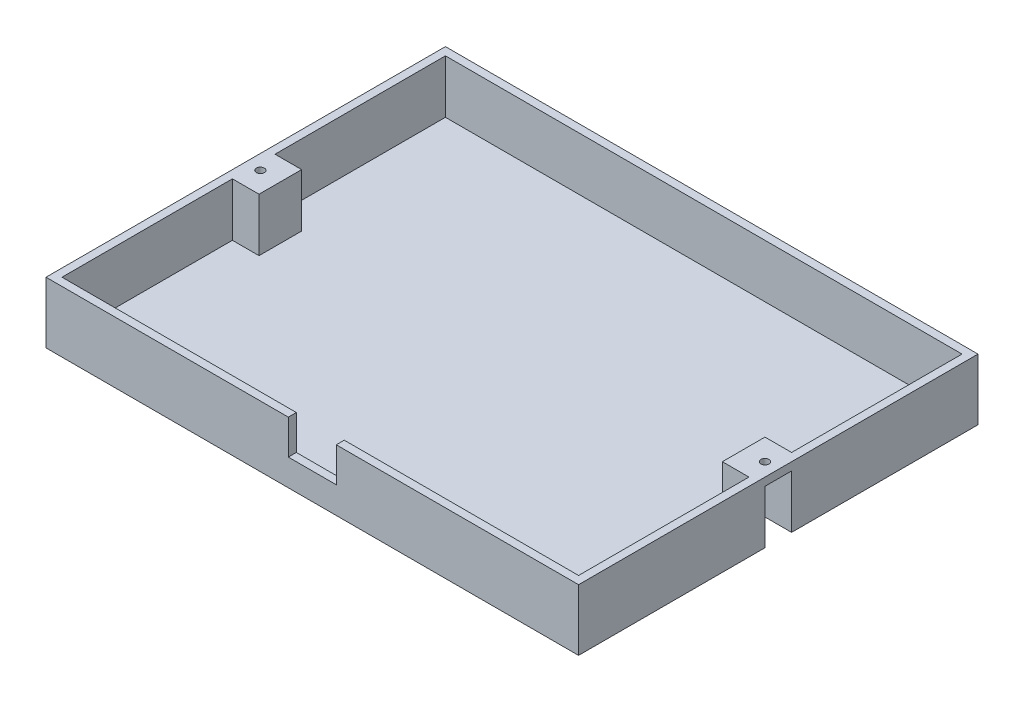
ISO-10303-21;
HEADER;
FILE_DESCRIPTION(('STEP AP214'),'2;1');
FILE_NAME('part.step','',(''),(''),'','','');
FILE_SCHEMA(('AUTOMOTIVE_DESIGN { 1 0 10303 214 1 1 1 1 }'));
ENDSEC;
DATA;
#1=APPLICATION_CONTEXT('core data for automotive mechanical design processes');
#2=APPLICATION_PROTOCOL_DEFINITION('international standard','automotive_design',2000,#1);
#3=PRODUCT_CONTEXT('',#1,'mechanical');
#4=PRODUCT('Part','Part','',(#3));
#5=PRODUCT_RELATED_PRODUCT_CATEGORY('part','',(#4));
#6=PRODUCT_DEFINITION_FORMATION('','',#4);
#7=PRODUCT_DEFINITION_CONTEXT('part definition',#1,'design');
#8=PRODUCT_DEFINITION('design','',#6,#7);
#9=PRODUCT_DEFINITION_SHAPE('','',#8);
#10=(LENGTH_UNIT() NAMED_UNIT(*) SI_UNIT(.MILLI.,.METRE.));
#11=(NAMED_UNIT(*) PLANE_ANGLE_UNIT() SI_UNIT($,.RADIAN.));
#12=(NAMED_UNIT(*) SI_UNIT($,.STERADIAN.) SOLID_ANGLE_UNIT());
#13=UNCERTAINTY_MEASURE_WITH_UNIT(LENGTH_MEASURE(1.E-05),#10,'distance_accuracy_value','');
#14=(GEOMETRIC_REPRESENTATION_CONTEXT(3) GLOBAL_UNCERTAINTY_ASSIGNED_CONTEXT((#13)) GLOBAL_UNIT_ASSIGNED_CONTEXT((#10,
#11,#12)) REPRESENTATION_CONTEXT('',''));
#15=CARTESIAN_POINT('',(0.,0.,0.));
#16=DIRECTION('',(0.,0.,1.));
#17=DIRECTION('',(1.,0.,0.));
#18=AXIS2_PLACEMENT_3D('',#15,#16,#17);
#19=CARTESIAN_POINT('',(100.,23.,5.));
#20=DIRECTION('',(0.,0.,1.));
#21=DIRECTION('',(1.,0.,0.));
#22=AXIS2_PLACEMENT_3D('',#19,#20,#21);
#23=PLANE('',#22);
#24=DIRECTION('',(1.,0.,0.));
#25=VECTOR('',#24,1.);
#26=CARTESIAN_POINT('',(90.,20.,5.));
#27=LINE('',#26,#25);
#28=CARTESIAN_POINT('',(90.,20.,5.));
#29=VERTEX_POINT('',#28);
#30=CARTESIAN_POINT('',(100.,20.,5.));
#31=VERTEX_POINT('',#30);
#32=EDGE_CURVE('E304',#29,#31,#27,.T.);
#33=ORIENTED_EDGE('',*,*,#32,.T.);
#34=DIRECTION('',(0.,-1.,0.));
#35=VECTOR('',#34,1.);
#36=CARTESIAN_POINT('',(100.,23.,5.));
#37=LINE('',#36,#35);
#38=CARTESIAN_POINT('',(100.,0.,5.));
#39=VERTEX_POINT('',#38);
#40=EDGE_CURVE('E499',#31,#39,#37,.T.);
#41=ORIENTED_EDGE('',*,*,#40,.T.);
#42=DIRECTION('',(1.,0.,0.));
#43=VECTOR('',#42,1.);
#44=CARTESIAN_POINT('',(90.,0.,5.));
#45=LINE('',#44,#43);
#46=CARTESIAN_POINT('',(90.,0.,5.));
#47=VERTEX_POINT('',#46);
#48=EDGE_CURVE('E296',#47,#39,#45,.T.);
#49=ORIENTED_EDGE('',*,*,#48,.F.);
#50=DIRECTION('',(0.,-1.,0.));
#51=VECTOR('',#50,1.);
#52=CARTESIAN_POINT('',(90.,23.,5.));
#53=LINE('',#52,#51);
#54=EDGE_CURVE('E496',#29,#47,#53,.T.);
#55=ORIENTED_EDGE('',*,*,#54,.F.);
#56=EDGE_LOOP('',(#33,#41,#49,#55));
#57=FACE_BOUND('',#56,.T.);
#58=ADVANCED_FACE('F39',(#57),#23,.F.);
#59=CARTESIAN_POINT('',(90.,23.,-5.));
#60=DIRECTION('',(-1.,0.,0.));
#61=DIRECTION('',(0.,0.,1.));
#62=AXIS2_PLACEMENT_3D('',#59,#60,#61);
#63=PLANE('',#62);
#64=DIRECTION('',(0.,0.,1.));
#65=VECTOR('',#64,1.);
#66=CARTESIAN_POINT('',(90.,20.,-5.));
#67=LINE('',#66,#65);
#68=CARTESIAN_POINT('',(90.,20.,-5.));
#69=VERTEX_POINT('',#68);
#70=EDGE_CURVE('E300',#69,#29,#67,.T.);
#71=ORIENTED_EDGE('',*,*,#70,.T.);
#72=ORIENTED_EDGE('',*,*,#54,.T.);
#73=DIRECTION('',(0.,0.,1.));
#74=VECTOR('',#73,1.);
#75=CARTESIAN_POINT('',(90.,0.,-5.));
#76=LINE('',#75,#74);
#77=CARTESIAN_POINT('',(90.,0.,-5.));
#78=VERTEX_POINT('',#77);
#79=EDGE_CURVE('E292',#78,#47,#76,.T.);
#80=ORIENTED_EDGE('',*,*,#79,.F.);
#81=DIRECTION('',(0.,-1.,0.));
#82=VECTOR('',#81,1.);
#83=CARTESIAN_POINT('',(90.,23.,-5.));
#84=LINE('',#83,#82);
#85=EDGE_CURVE('E63',#69,#78,#84,.T.);
#86=ORIENTED_EDGE('',*,*,#85,.F.);
#87=EDGE_LOOP('',(#71,#72,#80,#86));
#88=FACE_BOUND('',#87,.T.);
#89=ADVANCED_FACE('F605',(#88),#63,.F.);
#90=CARTESIAN_POINT('',(100.,23.,-5.));
#91=DIRECTION('',(0.,0.,-1.));
#92=DIRECTION('',(-1.,0.,0.));
#93=AXIS2_PLACEMENT_3D('',#90,#91,#92);
#94=PLANE('',#93);
#95=DIRECTION('',(-1.,0.,0.));
#96=VECTOR('',#95,1.);
#97=CARTESIAN_POINT('',(90.,20.,-5.));
#98=LINE('',#97,#96);
#99=CARTESIAN_POINT('',(100.,20.,-5.));
#100=VERTEX_POINT('',#99);
#101=EDGE_CURVE('E311',#100,#69,#98,.T.);
#102=ORIENTED_EDGE('',*,*,#101,.T.);
#103=ORIENTED_EDGE('',*,*,#85,.T.);
#104=DIRECTION('',(-1.,0.,0.));
#105=VECTOR('',#104,1.);
#106=CARTESIAN_POINT('',(100.,0.,-5.));
#107=LINE('',#106,#105);
#108=CARTESIAN_POINT('',(100.,0.,-5.));
#109=VERTEX_POINT('',#108);
#110=EDGE_CURVE('E285',#109,#78,#107,.T.);
#111=ORIENTED_EDGE('',*,*,#110,.F.);
#112=DIRECTION('',(0.,-1.,0.));
#113=VECTOR('',#112,1.);
#114=CARTESIAN_POINT('',(100.,23.,-5.));
#115=LINE('',#114,#113);
#116=EDGE_CURVE('E491',#100,#109,#115,.T.);
#117=ORIENTED_EDGE('',*,*,#116,.F.);
#118=EDGE_LOOP('',(#102,#103,#111,#117));
#119=FACE_BOUND('',#118,.T.);
#120=ADVANCED_FACE('F611',(#119),#94,.F.);
#121=CARTESIAN_POINT('',(-100.,23.,-5.));
#122=DIRECTION('',(0.,0.,-1.));
#123=DIRECTION('',(-1.,0.,0.));
#124=AXIS2_PLACEMENT_3D('',#121,#122,#123);
#125=PLANE('',#124);
#126=DIRECTION('',(-1.,0.,0.));
#127=VECTOR('',#126,1.);
#128=CARTESIAN_POINT('',(-100.,20.,-5.));
#129=LINE('',#128,#127);
#130=CARTESIAN_POINT('',(-90.,20.,-5.));
#131=VERTEX_POINT('',#130);
#132=CARTESIAN_POINT('',(-100.,20.,-5.));
#133=VERTEX_POINT('',#132);
#134=EDGE_CURVE('E338',#131,#133,#129,.T.);
#135=ORIENTED_EDGE('',*,*,#134,.T.);
#136=DIRECTION('',(0.,-1.,0.));
#137=VECTOR('',#136,1.);
#138=CARTESIAN_POINT('',(-100.,23.,-5.));
#139=LINE('',#138,#137);
#140=CARTESIAN_POINT('',(-100.,0.,-5.));
#141=VERTEX_POINT('',#140);
#142=EDGE_CURVE('E488',#133,#141,#139,.T.);
#143=ORIENTED_EDGE('',*,*,#142,.T.);
#144=DIRECTION('',(-1.,0.,0.));
#145=VECTOR('',#144,1.);
#146=CARTESIAN_POINT('',(-90.,0.,-5.));
#147=LINE('',#146,#145);
#148=CARTESIAN_POINT('',(-90.,0.,-5.));
#149=VERTEX_POINT('',#148);
#150=EDGE_CURVE('E322',#149,#141,#147,.T.);
#151=ORIENTED_EDGE('',*,*,#150,.F.);
#152=DIRECTION('',(0.,-1.,0.));
#153=VECTOR('',#152,1.);
#154=CARTESIAN_POINT('',(-90.,23.,-5.));
#155=LINE('',#154,#153);
#156=EDGE_CURVE('E485',#131,#149,#155,.T.);
#157=ORIENTED_EDGE('',*,*,#156,.F.);
#158=EDGE_LOOP('',(#135,#143,#151,#157));
#159=FACE_BOUND('',#158,.T.);
#160=ADVANCED_FACE('F543',(#159),#125,.F.);
#161=CARTESIAN_POINT('',(-90.,23.,-5.));
#162=DIRECTION('',(1.,0.,0.));
#163=DIRECTION('',(0.,0.,-1.));
#164=AXIS2_PLACEMENT_3D('',#161,#162,#163);
#165=PLANE('',#164);
#166=DIRECTION('',(0.,0.,-1.));
#167=VECTOR('',#166,1.);
#168=CARTESIAN_POINT('',(-90.,20.,-5.));
#169=LINE('',#168,#167);
#170=CARTESIAN_POINT('',(-90.,20.,5.));
#171=VERTEX_POINT('',#170);
#172=EDGE_CURVE('E334',#171,#131,#169,.T.);
#173=ORIENTED_EDGE('',*,*,#172,.T.);
#174=ORIENTED_EDGE('',*,*,#156,.T.);
#175=DIRECTION('',(0.,0.,-1.));
#176=VECTOR('',#175,1.);
#177=CARTESIAN_POINT('',(-90.,0.,5.));
#178=LINE('',#177,#176);
#179=CARTESIAN_POINT('',(-90.,0.,5.));
#180=VERTEX_POINT('',#179);
#181=EDGE_CURVE('E318',#180,#149,#178,.T.);
#182=ORIENTED_EDGE('',*,*,#181,.F.);
#183=DIRECTION('',(0.,-1.,0.));
#184=VECTOR('',#183,1.);
#185=CARTESIAN_POINT('',(-90.,23.,5.));
#186=LINE('',#185,#184);
#187=EDGE_CURVE('E482',#171,#180,#186,.T.);
#188=ORIENTED_EDGE('',*,*,#187,.F.);
#189=EDGE_LOOP('',(#173,#174,#182,#188));
#190=FACE_BOUND('',#189,.T.);
#191=ADVANCED_FACE('F837',(#190),#165,.F.);
#192=CARTESIAN_POINT('',(-100.,23.,5.));
#193=DIRECTION('',(0.,0.,1.));
#194=DIRECTION('',(1.,0.,0.));
#195=AXIS2_PLACEMENT_3D('',#192,#193,#194);
#196=PLANE('',#195);
#197=DIRECTION('',(1.,0.,0.));
#198=VECTOR('',#197,1.);
#199=CARTESIAN_POINT('',(-100.,20.,5.));
#200=LINE('',#199,#198);
#201=CARTESIAN_POINT('',(-100.,20.,5.));
#202=VERTEX_POINT('',#201);
#203=EDGE_CURVE('E330',#202,#171,#200,.T.);
#204=ORIENTED_EDGE('',*,*,#203,.T.);
#205=ORIENTED_EDGE('',*,*,#187,.T.);
#206=DIRECTION('',(1.,0.,0.));
#207=VECTOR('',#206,1.);
#208=CARTESIAN_POINT('',(-100.,0.,5.));
#209=LINE('',#208,#207);
#210=CARTESIAN_POINT('',(-100.,0.,5.));
#211=VERTEX_POINT('',#210);
#212=EDGE_CURVE('E314',#211,#180,#209,.T.);
#213=ORIENTED_EDGE('',*,*,#212,.F.);
#214=DIRECTION('',(0.,-1.,0.));
#215=VECTOR('',#214,1.);
#216=CARTESIAN_POINT('',(-100.,23.,5.));
#217=LINE('',#216,#215);
#218=EDGE_CURVE('E479',#202,#211,#217,.T.);
#219=ORIENTED_EDGE('',*,*,#218,.F.);
#220=EDGE_LOOP('',(#204,#205,#213,#219));
#221=FACE_BOUND('',#220,.T.);
#222=ADVANCED_FACE('F548',(#221),#196,.F.);
#223=CARTESIAN_POINT('',(100.,3.,-75.));
#224=DIRECTION('',(-1.,0.,0.));
#225=DIRECTION('',(0.,0.,1.));
#226=AXIS2_PLACEMENT_3D('',#223,#224,#225);
#227=PLANE('',#226);
#228=DIRECTION('',(0.,0.,-1.));
#229=VECTOR('',#228,1.);
#230=CARTESIAN_POINT('',(100.,0.,-75.));
#231=LINE('',#230,#229);
#232=CARTESIAN_POINT('',(100.,0.,75.));
#233=VERTEX_POINT('',#232);
#234=EDGE_CURVE('E503',#233,#39,#231,.T.);
#235=ORIENTED_EDGE('',*,*,#234,.T.);
#236=ORIENTED_EDGE('',*,*,#40,.F.);
#237=DIRECTION('',(0.,0.,-1.));
#238=VECTOR('',#237,1.);
#239=CARTESIAN_POINT('',(100.,20.,-5.));
#240=LINE('',#239,#238);
#241=EDGE_CURVE('E308',#31,#100,#240,.T.);
#242=ORIENTED_EDGE('',*,*,#241,.T.);
#243=ORIENTED_EDGE('',*,*,#116,.T.);
#244=CARTESIAN_POINT('',(100.,0.,-75.));
#245=VERTEX_POINT('',#244);
#246=EDGE_CURVE('E502',#109,#245,#231,.T.);
#247=ORIENTED_EDGE('',*,*,#246,.T.);
#248=DIRECTION('',(0.,-1.,0.));
#249=VECTOR('',#248,1.);
#250=CARTESIAN_POINT('',(100.,3.,-75.));
#251=LINE('',#250,#249);
#252=CARTESIAN_POINT('',(100.,23.,-75.));
#253=VERTEX_POINT('',#252);
#254=EDGE_CURVE('E11',#253,#245,#251,.T.);
#255=ORIENTED_EDGE('',*,*,#254,.F.);
#256=DIRECTION('',(0.,0.,-1.));
#257=VECTOR('',#256,1.);
#258=CARTESIAN_POINT('',(100.,23.,75.));
#259=LINE('',#258,#257);
#260=CARTESIAN_POINT('',(100.,23.,75.));
#261=VERTEX_POINT('',#260);
#262=EDGE_CURVE('E469',#261,#253,#259,.T.);
#263=ORIENTED_EDGE('',*,*,#262,.F.);
#264=DIRECTION('',(0.,-1.,0.));
#265=VECTOR('',#264,1.);
#266=CARTESIAN_POINT('',(100.,3.,75.));
#267=LINE('',#266,#265);
#268=EDGE_CURVE('E518',#261,#233,#267,.T.);
#269=ORIENTED_EDGE('',*,*,#268,.T.);
#270=EDGE_LOOP('',(#235,#236,#242,#243,#247,#255,#263,#269));
#271=FACE_BOUND('',#270,.T.);
#272=ADVANCED_FACE('F41',(#271),#227,.F.);
#273=CARTESIAN_POINT('',(-100.,3.,-75.));
#274=DIRECTION('',(0.,0.,1.));
#275=DIRECTION('',(1.,0.,0.));
#276=AXIS2_PLACEMENT_3D('',#273,#274,#275);
#277=PLANE('',#276);
#278=DIRECTION('',(-1.,0.,0.));
#279=VECTOR('',#278,1.);
#280=CARTESIAN_POINT('',(-100.,0.,-75.));
#281=LINE('',#280,#279);
#282=CARTESIAN_POINT('',(-100.,0.,-75.));
#283=VERTEX_POINT('',#282);
#284=EDGE_CURVE('E507',#245,#283,#281,.T.);
#285=ORIENTED_EDGE('',*,*,#284,.T.);
#286=DIRECTION('',(0.,-1.,0.));
#287=VECTOR('',#286,1.);
#288=CARTESIAN_POINT('',(-100.,3.,-75.));
#289=LINE('',#288,#287);
#290=CARTESIAN_POINT('',(-100.,23.,-75.));
#291=VERTEX_POINT('',#290);
#292=EDGE_CURVE('E48',#291,#283,#289,.T.);
#293=ORIENTED_EDGE('',*,*,#292,.F.);
#294=DIRECTION('',(-1.,0.,0.));
#295=VECTOR('',#294,1.);
#296=CARTESIAN_POINT('',(100.,23.,-75.));
#297=LINE('',#296,#295);
#298=EDGE_CURVE('E472',#253,#291,#297,.T.);
#299=ORIENTED_EDGE('',*,*,#298,.F.);
#300=ORIENTED_EDGE('',*,*,#254,.T.);
#301=EDGE_LOOP('',(#285,#293,#299,#300));
#302=FACE_BOUND('',#301,.T.);
#303=ADVANCED_FACE('F597',(#302),#277,.F.);
#304=CARTESIAN_POINT('',(-100.,3.,-75.));
#305=DIRECTION('',(1.,0.,0.));
#306=DIRECTION('',(0.,0.,-1.));
#307=AXIS2_PLACEMENT_3D('',#304,#305,#306);
#308=PLANE('',#307);
#309=DIRECTION('',(0.,0.,1.));
#310=VECTOR('',#309,1.);
#311=CARTESIAN_POINT('',(-100.,0.,-75.));
#312=LINE('',#311,#310);
#313=EDGE_CURVE('E511',#283,#141,#312,.T.);
#314=ORIENTED_EDGE('',*,*,#313,.T.);
#315=ORIENTED_EDGE('',*,*,#142,.F.);
#316=DIRECTION('',(0.,0.,1.));
#317=VECTOR('',#316,1.);
#318=CARTESIAN_POINT('',(-100.,20.,-5.));
#319=LINE('',#318,#317);
#320=EDGE_CURVE('E326',#133,#202,#319,.T.);
#321=ORIENTED_EDGE('',*,*,#320,.T.);
#322=ORIENTED_EDGE('',*,*,#218,.T.);
#323=CARTESIAN_POINT('',(-100.,0.,75.));
#324=VERTEX_POINT('',#323);
#325=EDGE_CURVE('E510',#211,#324,#312,.T.);
#326=ORIENTED_EDGE('',*,*,#325,.T.);
#327=DIRECTION('',(0.,-1.,0.));
#328=VECTOR('',#327,1.);
#329=CARTESIAN_POINT('',(-100.,3.,75.));
#330=LINE('',#329,#328);
#331=CARTESIAN_POINT('',(-100.,23.,75.));
#332=VERTEX_POINT('',#331);
#333=EDGE_CURVE('E522',#332,#324,#330,.T.);
#334=ORIENTED_EDGE('',*,*,#333,.F.);
#335=DIRECTION('',(0.,0.,1.));
#336=VECTOR('',#335,1.);
#337=CARTESIAN_POINT('',(-100.,23.,-75.));
#338=LINE('',#337,#336);
#339=EDGE_CURVE('E476',#291,#332,#338,.T.);
#340=ORIENTED_EDGE('',*,*,#339,.F.);
#341=ORIENTED_EDGE('',*,*,#292,.T.);
#342=EDGE_LOOP('',(#314,#315,#321,#322,#326,#334,#340,#341));
#343=FACE_BOUND('',#342,.T.);
#344=ADVANCED_FACE('F530',(#343),#308,.F.);
#345=CARTESIAN_POINT('',(-100.,3.,75.));
#346=DIRECTION('',(0.,0.,-1.));
#347=DIRECTION('',(-1.,0.,0.));
#348=AXIS2_PLACEMENT_3D('',#345,#346,#347);
#349=PLANE('',#348);
#350=DIRECTION('',(1.,0.,0.));
#351=VECTOR('',#350,1.);
#352=CARTESIAN_POINT('',(-9.,10.,75.));
#353=LINE('',#352,#351);
#354=CARTESIAN_POINT('',(-9.,10.,75.));
#355=VERTEX_POINT('',#354);
#356=CARTESIAN_POINT('',(9.,10.,75.));
#357=VERTEX_POINT('',#356);
#358=EDGE_CURVE('E254',#355,#357,#353,.T.);
#359=ORIENTED_EDGE('',*,*,#358,.F.);
#360=DIRECTION('',(0.,-1.,0.));
#361=VECTOR('',#360,1.);
#362=CARTESIAN_POINT('',(-9.,23.,75.));
#363=LINE('',#362,#361);
#364=CARTESIAN_POINT('',(-9.,23.,75.));
#365=VERTEX_POINT('',#364);
#366=EDGE_CURVE('E233',#365,#355,#363,.T.);
#367=ORIENTED_EDGE('',*,*,#366,.F.);
#368=DIRECTION('',(1.,0.,0.));
#369=VECTOR('',#368,1.);
#370=CARTESIAN_POINT('',(-100.,23.,75.));
#371=LINE('',#370,#369);
#372=EDGE_CURVE('E465',#332,#365,#371,.T.);
#373=ORIENTED_EDGE('',*,*,#372,.F.);
#374=ORIENTED_EDGE('',*,*,#333,.T.);
#375=DIRECTION('',(1.,0.,0.));
#376=VECTOR('',#375,1.);
#377=CARTESIAN_POINT('',(-100.,0.,75.));
#378=LINE('',#377,#376);
#379=EDGE_CURVE('E515',#324,#233,#378,.T.);
#380=ORIENTED_EDGE('',*,*,#379,.T.);
#381=ORIENTED_EDGE('',*,*,#268,.F.);
#382=CARTESIAN_POINT('',(9.,23.,75.));
#383=VERTEX_POINT('',#382);
#384=EDGE_CURVE('E464',#383,#261,#371,.T.);
#385=ORIENTED_EDGE('',*,*,#384,.F.);
#386=DIRECTION('',(0.,1.,0.));
#387=VECTOR('',#386,1.);
#388=CARTESIAN_POINT('',(9.,23.,75.));
#389=LINE('',#388,#387);
#390=EDGE_CURVE('E251',#357,#383,#389,.T.);
#391=ORIENTED_EDGE('',*,*,#390,.F.);
#392=EDGE_LOOP('',(#359,#367,#373,#374,#380,#381,#385,#391));
#393=FACE_BOUND('',#392,.T.);
#394=ADVANCED_FACE('F589',(#393),#349,.F.);
#395=CARTESIAN_POINT('',(0.,0.,0.));
#396=DIRECTION('',(0.,1.,0.));
#397=DIRECTION('',(0.,0.,1.));
#398=AXIS2_PLACEMENT_3D('',#395,#396,#397);
#399=PLANE('',#398);
#400=ORIENTED_EDGE('',*,*,#79,.T.);
#401=ORIENTED_EDGE('',*,*,#48,.T.);
#402=ORIENTED_EDGE('',*,*,#234,.F.);
#403=ORIENTED_EDGE('',*,*,#379,.F.);
#404=ORIENTED_EDGE('',*,*,#325,.F.);
#405=ORIENTED_EDGE('',*,*,#212,.T.);
#406=ORIENTED_EDGE('',*,*,#181,.T.);
#407=ORIENTED_EDGE('',*,*,#150,.T.);
#408=ORIENTED_EDGE('',*,*,#313,.F.);
#409=ORIENTED_EDGE('',*,*,#284,.F.);
#410=ORIENTED_EDGE('',*,*,#246,.F.);
#411=ORIENTED_EDGE('',*,*,#110,.T.);
#412=EDGE_LOOP('',(#400,#401,#402,#403,#404,#405,#406,#407,#408,#409,#410,#411));
#413=FACE_BOUND('',#412,.T.);
#414=ADVANCED_FACE('F537',(#413),#399,.F.);
#415=CARTESIAN_POINT('',(0.,23.,0.));
#416=DIRECTION('',(0.,1.,0.));
#417=DIRECTION('',(0.,0.,1.));
#418=AXIS2_PLACEMENT_3D('',#415,#416,#417);
#419=PLANE('',#418);
#420=DIRECTION('',(0.,0.,1.));
#421=VECTOR('',#420,1.);
#422=CARTESIAN_POINT('',(-9.,23.,72.));
#423=LINE('',#422,#421);
#424=CARTESIAN_POINT('',(-9.,23.,72.));
#425=VERTEX_POINT('',#424);
#426=EDGE_CURVE('E263',#425,#365,#423,.T.);
#427=ORIENTED_EDGE('',*,*,#426,.F.);
#428=DIRECTION('',(1.,0.,0.));
#429=VECTOR('',#428,1.);
#430=CARTESIAN_POINT('',(-97.,23.,72.));
#431=LINE('',#430,#429);
#432=CARTESIAN_POINT('',(-97.,23.,72.));
#433=VERTEX_POINT('',#432);
#434=EDGE_CURVE('E249',#433,#425,#431,.T.);
#435=ORIENTED_EDGE('',*,*,#434,.F.);
#436=DIRECTION('',(0.,0.,1.));
#437=VECTOR('',#436,1.);
#438=CARTESIAN_POINT('',(-97.,23.,8.));
#439=LINE('',#438,#437);
#440=CARTESIAN_POINT('',(-97.,23.,8.));
#441=VERTEX_POINT('',#440);
#442=EDGE_CURVE('E374',#441,#433,#439,.T.);
#443=ORIENTED_EDGE('',*,*,#442,.F.);
#444=DIRECTION('',(-1.,0.,0.));
#445=VECTOR('',#444,1.);
#446=CARTESIAN_POINT('',(-97.,23.,8.));
#447=LINE('',#446,#445);
#448=CARTESIAN_POINT('',(-87.,23.,8.));
#449=VERTEX_POINT('',#448);
#450=EDGE_CURVE('E371',#449,#441,#447,.T.);
#451=ORIENTED_EDGE('',*,*,#450,.F.);
#452=DIRECTION('',(0.,0.,1.));
#453=VECTOR('',#452,1.);
#454=CARTESIAN_POINT('',(-87.,23.,-8.));
#455=LINE('',#454,#453);
#456=CARTESIAN_POINT('',(-87.,23.,-8.));
#457=VERTEX_POINT('',#456);
#458=EDGE_CURVE('E368',#457,#449,#455,.T.);
#459=ORIENTED_EDGE('',*,*,#458,.F.);
#460=DIRECTION('',(1.,0.,0.));
#461=VECTOR('',#460,1.);
#462=CARTESIAN_POINT('',(-97.,23.,-8.));
#463=LINE('',#462,#461);
#464=CARTESIAN_POINT('',(-97.,23.,-8.));
#465=VERTEX_POINT('',#464);
#466=EDGE_CURVE('E365',#465,#457,#463,.T.);
#467=ORIENTED_EDGE('',*,*,#466,.F.);
#468=DIRECTION('',(0.,0.,1.));
#469=VECTOR('',#468,1.);
#470=CARTESIAN_POINT('',(-97.,23.,-72.));
#471=LINE('',#470,#469);
#472=CARTESIAN_POINT('',(-97.,23.,-72.));
#473=VERTEX_POINT('',#472);
#474=EDGE_CURVE('E362',#473,#465,#471,.T.);
#475=ORIENTED_EDGE('',*,*,#474,.F.);
#476=DIRECTION('',(-1.,0.,0.));
#477=VECTOR('',#476,1.);
#478=CARTESIAN_POINT('',(97.,23.,-72.));
#479=LINE('',#478,#477);
#480=CARTESIAN_POINT('',(97.,23.,-72.));
#481=VERTEX_POINT('',#480);
#482=EDGE_CURVE('E359',#481,#473,#479,.T.);
#483=ORIENTED_EDGE('',*,*,#482,.F.);
#484=DIRECTION('',(0.,0.,-1.));
#485=VECTOR('',#484,1.);
#486=CARTESIAN_POINT('',(97.,23.,-8.));
#487=LINE('',#486,#485);
#488=CARTESIAN_POINT('',(97.,23.,-8.));
#489=VERTEX_POINT('',#488);
#490=EDGE_CURVE('E356',#489,#481,#487,.T.);
#491=ORIENTED_EDGE('',*,*,#490,.F.);
#492=DIRECTION('',(1.,0.,0.));
#493=VECTOR('',#492,1.);
#494=CARTESIAN_POINT('',(97.,23.,-8.));
#495=LINE('',#494,#493);
#496=CARTESIAN_POINT('',(87.,23.,-8.));
#497=VERTEX_POINT('',#496);
#498=EDGE_CURVE('E353',#497,#489,#495,.T.);
#499=ORIENTED_EDGE('',*,*,#498,.F.);
#500=DIRECTION('',(0.,0.,-1.));
#501=VECTOR('',#500,1.);
#502=CARTESIAN_POINT('',(87.,23.,-8.));
#503=LINE('',#502,#501);
#504=CARTESIAN_POINT('',(87.,23.,8.));
#505=VERTEX_POINT('',#504);
#506=EDGE_CURVE('E350',#505,#497,#503,.T.);
#507=ORIENTED_EDGE('',*,*,#506,.F.);
#508=DIRECTION('',(-1.,0.,0.));
#509=VECTOR('',#508,1.);
#510=CARTESIAN_POINT('',(97.,23.,8.));
#511=LINE('',#510,#509);
#512=CARTESIAN_POINT('',(97.,23.,8.));
#513=VERTEX_POINT('',#512);
#514=EDGE_CURVE('E346',#513,#505,#511,.T.);
#515=ORIENTED_EDGE('',*,*,#514,.F.);
#516=DIRECTION('',(0.,0.,-1.));
#517=VECTOR('',#516,1.);
#518=CARTESIAN_POINT('',(97.,23.,72.));
#519=LINE('',#518,#517);
#520=CARTESIAN_POINT('',(97.,23.,72.));
#521=VERTEX_POINT('',#520);
#522=EDGE_CURVE('E343',#521,#513,#519,.T.);
#523=ORIENTED_EDGE('',*,*,#522,.F.);
#524=CARTESIAN_POINT('',(9.,23.,72.));
#525=VERTEX_POINT('',#524);
#526=EDGE_CURVE('E378',#525,#521,#431,.T.);
#527=ORIENTED_EDGE('',*,*,#526,.F.);
#528=DIRECTION('',(0.,0.,1.));
#529=VECTOR('',#528,1.);
#530=CARTESIAN_POINT('',(9.,23.,72.));
#531=LINE('',#530,#529);
#532=EDGE_CURVE('E267',#525,#383,#531,.T.);
#533=ORIENTED_EDGE('',*,*,#532,.T.);
#534=ORIENTED_EDGE('',*,*,#384,.T.);
#535=ORIENTED_EDGE('',*,*,#262,.T.);
#536=ORIENTED_EDGE('',*,*,#298,.T.);
#537=ORIENTED_EDGE('',*,*,#339,.T.);
#538=ORIENTED_EDGE('',*,*,#372,.T.);
#539=EDGE_LOOP('',(#427,#435,#443,#451,#459,#467,#475,#483,#491,#499,#507,#515,#523,#527,#533,
#534,#535,#536,#537,#538));
#540=FACE_BOUND('',#539,.T.);
#541=CARTESIAN_POINT('',(-94.5,23.,0.));
#542=DIRECTION('',(0.,-1.,0.));
#543=DIRECTION('',(0.,0.,-1.));
#544=AXIS2_PLACEMENT_3D('',#541,#542,#543);
#545=CIRCLE('',#544,1.5);
#546=CARTESIAN_POINT('',(-94.5,23.,-1.5));
#547=VERTEX_POINT('',#546);
#548=EDGE_CURVE('E273',#547,#547,#545,.T.);
#549=ORIENTED_EDGE('',*,*,#548,.T.);
#550=EDGE_LOOP('',(#549));
#551=FACE_BOUND('',#550,.T.);
#552=CARTESIAN_POINT('',(95.,23.,0.));
#553=DIRECTION('',(0.,-1.,0.));
#554=DIRECTION('',(0.,0.,-1.));
#555=AXIS2_PLACEMENT_3D('',#552,#553,#554);
#556=CIRCLE('',#555,1.5);
#557=CARTESIAN_POINT('',(95.,23.,-1.5));
#558=VERTEX_POINT('',#557);
#559=EDGE_CURVE('E281',#558,#558,#556,.T.);
#560=ORIENTED_EDGE('',*,*,#559,.T.);
#561=EDGE_LOOP('',(#560));
#562=FACE_BOUND('',#561,.T.);
#563=ADVANCED_FACE('F567',(#540,#551,#562),#419,.T.);
#564=CARTESIAN_POINT('',(97.,23.,72.));
#565=DIRECTION('',(-1.,0.,0.));
#566=DIRECTION('',(0.,0.,1.));
#567=AXIS2_PLACEMENT_3D('',#564,#565,#566);
#568=PLANE('',#567);
#569=DIRECTION('',(0.,0.,-1.));
#570=VECTOR('',#569,1.);
#571=CARTESIAN_POINT('',(97.,3.,72.));
#572=LINE('',#571,#570);
#573=CARTESIAN_POINT('',(97.,3.,72.));
#574=VERTEX_POINT('',#573);
#575=CARTESIAN_POINT('',(97.,3.,8.));
#576=VERTEX_POINT('',#575);
#577=EDGE_CURVE('E342',#574,#576,#572,.T.);
#578=ORIENTED_EDGE('',*,*,#577,.F.);
#579=DIRECTION('',(0.,-1.,0.));
#580=VECTOR('',#579,1.);
#581=CARTESIAN_POINT('',(97.,23.,72.));
#582=LINE('',#581,#580);
#583=EDGE_CURVE('E381',#521,#574,#582,.T.);
#584=ORIENTED_EDGE('',*,*,#583,.F.);
#585=ORIENTED_EDGE('',*,*,#522,.T.);
#586=DIRECTION('',(0.,-1.,0.));
#587=VECTOR('',#586,1.);
#588=CARTESIAN_POINT('',(97.,23.,8.));
#589=LINE('',#588,#587);
#590=EDGE_CURVE('E460',#513,#576,#589,.T.);
#591=ORIENTED_EDGE('',*,*,#590,.T.);
#592=EDGE_LOOP('',(#578,#584,#585,#591));
#593=FACE_BOUND('',#592,.T.);
#594=ADVANCED_FACE('F564',(#593),#568,.T.);
#595=CARTESIAN_POINT('',(97.,23.,8.));
#596=DIRECTION('',(0.,0.,1.));
#597=DIRECTION('',(1.,0.,0.));
#598=AXIS2_PLACEMENT_3D('',#595,#596,#597);
#599=PLANE('',#598);
#600=DIRECTION('',(-1.,0.,0.));
#601=VECTOR('',#600,1.);
#602=CARTESIAN_POINT('',(97.,3.,8.));
#603=LINE('',#602,#601);
#604=CARTESIAN_POINT('',(87.,3.,8.));
#605=VERTEX_POINT('',#604);
#606=EDGE_CURVE('E385',#576,#605,#603,.T.);
#607=ORIENTED_EDGE('',*,*,#606,.F.);
#608=ORIENTED_EDGE('',*,*,#590,.F.);
#609=ORIENTED_EDGE('',*,*,#514,.T.);
#610=DIRECTION('',(0.,-1.,0.));
#611=VECTOR('',#610,1.);
#612=CARTESIAN_POINT('',(87.,23.,8.));
#613=LINE('',#612,#611);
#614=EDGE_CURVE('E457',#505,#605,#613,.T.);
#615=ORIENTED_EDGE('',*,*,#614,.T.);
#616=EDGE_LOOP('',(#607,#608,#609,#615));
#617=FACE_BOUND('',#616,.T.);
#618=ADVANCED_FACE('F573',(#617),#599,.T.);
#619=CARTESIAN_POINT('',(87.,23.,-8.));
#620=DIRECTION('',(-1.,0.,0.));
#621=DIRECTION('',(0.,0.,1.));
#622=AXIS2_PLACEMENT_3D('',#619,#620,#621);
#623=PLANE('',#622);
#624=DIRECTION('',(0.,0.,-1.));
#625=VECTOR('',#624,1.);
#626=CARTESIAN_POINT('',(87.,3.,-8.));
#627=LINE('',#626,#625);
#628=CARTESIAN_POINT('',(87.,3.,-8.));
#629=VERTEX_POINT('',#628);
#630=EDGE_CURVE('E389',#605,#629,#627,.T.);
#631=ORIENTED_EDGE('',*,*,#630,.F.);
#632=ORIENTED_EDGE('',*,*,#614,.F.);
#633=ORIENTED_EDGE('',*,*,#506,.T.);
#634=DIRECTION('',(0.,-1.,0.));
#635=VECTOR('',#634,1.);
#636=CARTESIAN_POINT('',(87.,23.,-8.));
#637=LINE('',#636,#635);
#638=EDGE_CURVE('E454',#497,#629,#637,.T.);
#639=ORIENTED_EDGE('',*,*,#638,.T.);
#640=EDGE_LOOP('',(#631,#632,#633,#639));
#641=FACE_BOUND('',#640,.T.);
#642=ADVANCED_FACE('F576',(#641),#623,.T.);
#643=CARTESIAN_POINT('',(97.,23.,-8.));
#644=DIRECTION('',(0.,0.,-1.));
#645=DIRECTION('',(-1.,0.,0.));
#646=AXIS2_PLACEMENT_3D('',#643,#644,#645);
#647=PLANE('',#646);
#648=DIRECTION('',(1.,0.,0.));
#649=VECTOR('',#648,1.);
#650=CARTESIAN_POINT('',(97.,3.,-8.));
#651=LINE('',#650,#649);
#652=CARTESIAN_POINT('',(97.,3.,-8.));
#653=VERTEX_POINT('',#652);
#654=EDGE_CURVE('E393',#629,#653,#651,.T.);
#655=ORIENTED_EDGE('',*,*,#654,.F.);
#656=ORIENTED_EDGE('',*,*,#638,.F.);
#657=ORIENTED_EDGE('',*,*,#498,.T.);
#658=DIRECTION('',(0.,-1.,0.));
#659=VECTOR('',#658,1.);
#660=CARTESIAN_POINT('',(97.,23.,-8.));
#661=LINE('',#660,#659);
#662=EDGE_CURVE('E451',#489,#653,#661,.T.);
#663=ORIENTED_EDGE('',*,*,#662,.T.);
#664=EDGE_LOOP('',(#655,#656,#657,#663));
#665=FACE_BOUND('',#664,.T.);
#666=ADVANCED_FACE('F658',(#665),#647,.T.);
#667=CARTESIAN_POINT('',(97.,23.,-8.));
#668=DIRECTION('',(-1.,0.,0.));
#669=DIRECTION('',(0.,0.,1.));
#670=AXIS2_PLACEMENT_3D('',#667,#668,#669);
#671=PLANE('',#670);
#672=DIRECTION('',(0.,0.,-1.));
#673=VECTOR('',#672,1.);
#674=CARTESIAN_POINT('',(97.,3.,-8.));
#675=LINE('',#674,#673);
#676=CARTESIAN_POINT('',(97.,3.,-72.));
#677=VERTEX_POINT('',#676);
#678=EDGE_CURVE('E397',#653,#677,#675,.T.);
#679=ORIENTED_EDGE('',*,*,#678,.F.);
#680=ORIENTED_EDGE('',*,*,#662,.F.);
#681=ORIENTED_EDGE('',*,*,#490,.T.);
#682=DIRECTION('',(0.,-1.,0.));
#683=VECTOR('',#682,1.);
#684=CARTESIAN_POINT('',(97.,23.,-72.));
#685=LINE('',#684,#683);
#686=EDGE_CURVE('E448',#481,#677,#685,.T.);
#687=ORIENTED_EDGE('',*,*,#686,.T.);
#688=EDGE_LOOP('',(#679,#680,#681,#687));
#689=FACE_BOUND('',#688,.T.);
#690=ADVANCED_FACE('F665',(#689),#671,.T.);
#691=CARTESIAN_POINT('',(97.,23.,-72.));
#692=DIRECTION('',(0.,0.,1.));
#693=DIRECTION('',(1.,0.,0.));
#694=AXIS2_PLACEMENT_3D('',#691,#692,#693);
#695=PLANE('',#694);
#696=DIRECTION('',(-1.,0.,0.));
#697=VECTOR('',#696,1.);
#698=CARTESIAN_POINT('',(97.,3.,-72.));
#699=LINE('',#698,#697);
#700=CARTESIAN_POINT('',(-97.,3.,-72.));
#701=VERTEX_POINT('',#700);
#702=EDGE_CURVE('E401',#677,#701,#699,.T.);
#703=ORIENTED_EDGE('',*,*,#702,.F.);
#704=ORIENTED_EDGE('',*,*,#686,.F.);
#705=ORIENTED_EDGE('',*,*,#482,.T.);
#706=DIRECTION('',(0.,-1.,0.));
#707=VECTOR('',#706,1.);
#708=CARTESIAN_POINT('',(-97.,23.,-72.));
#709=LINE('',#708,#707);
#710=EDGE_CURVE('E445',#473,#701,#709,.T.);
#711=ORIENTED_EDGE('',*,*,#710,.T.);
#712=EDGE_LOOP('',(#703,#704,#705,#711));
#713=FACE_BOUND('',#712,.T.);
#714=ADVANCED_FACE('F673',(#713),#695,.T.);
#715=CARTESIAN_POINT('',(-97.,23.,-72.));
#716=DIRECTION('',(1.,0.,0.));
#717=DIRECTION('',(0.,0.,-1.));
#718=AXIS2_PLACEMENT_3D('',#715,#716,#717);
#719=PLANE('',#718);
#720=DIRECTION('',(0.,0.,1.));
#721=VECTOR('',#720,1.);
#722=CARTESIAN_POINT('',(-97.,3.,-72.));
#723=LINE('',#722,#721);
#724=CARTESIAN_POINT('',(-97.,3.,-8.));
#725=VERTEX_POINT('',#724);
#726=EDGE_CURVE('E405',#701,#725,#723,.T.);
#727=ORIENTED_EDGE('',*,*,#726,.F.);
#728=ORIENTED_EDGE('',*,*,#710,.F.);
#729=ORIENTED_EDGE('',*,*,#474,.T.);
#730=DIRECTION('',(0.,-1.,0.));
#731=VECTOR('',#730,1.);
#732=CARTESIAN_POINT('',(-97.,23.,-8.));
#733=LINE('',#732,#731);
#734=EDGE_CURVE('E442',#465,#725,#733,.T.);
#735=ORIENTED_EDGE('',*,*,#734,.T.);
#736=EDGE_LOOP('',(#727,#728,#729,#735));
#737=FACE_BOUND('',#736,.T.);
#738=ADVANCED_FACE('F681',(#737),#719,.T.);
#739=CARTESIAN_POINT('',(-97.,23.,-8.));
#740=DIRECTION('',(0.,0.,-1.));
#741=DIRECTION('',(-1.,0.,0.));
#742=AXIS2_PLACEMENT_3D('',#739,#740,#741);
#743=PLANE('',#742);
#744=DIRECTION('',(1.,0.,0.));
#745=VECTOR('',#744,1.);
#746=CARTESIAN_POINT('',(-97.,3.,-8.));
#747=LINE('',#746,#745);
#748=CARTESIAN_POINT('',(-87.,3.,-8.));
#749=VERTEX_POINT('',#748);
#750=EDGE_CURVE('E409',#725,#749,#747,.T.);
#751=ORIENTED_EDGE('',*,*,#750,.F.);
#752=ORIENTED_EDGE('',*,*,#734,.F.);
#753=ORIENTED_EDGE('',*,*,#466,.T.);
#754=DIRECTION('',(0.,-1.,0.));
#755=VECTOR('',#754,1.);
#756=CARTESIAN_POINT('',(-87.,23.,-8.));
#757=LINE('',#756,#755);
#758=EDGE_CURVE('E439',#457,#749,#757,.T.);
#759=ORIENTED_EDGE('',*,*,#758,.T.);
#760=EDGE_LOOP('',(#751,#752,#753,#759));
#761=FACE_BOUND('',#760,.T.);
#762=ADVANCED_FACE('F689',(#761),#743,.T.);
#763=CARTESIAN_POINT('',(-87.,23.,-8.));
#764=DIRECTION('',(1.,0.,0.));
#765=DIRECTION('',(0.,0.,-1.));
#766=AXIS2_PLACEMENT_3D('',#763,#764,#765);
#767=PLANE('',#766);
#768=DIRECTION('',(0.,0.,1.));
#769=VECTOR('',#768,1.);
#770=CARTESIAN_POINT('',(-87.,3.,-8.));
#771=LINE('',#770,#769);
#772=CARTESIAN_POINT('',(-87.,3.,8.));
#773=VERTEX_POINT('',#772);
#774=EDGE_CURVE('E413',#749,#773,#771,.T.);
#775=ORIENTED_EDGE('',*,*,#774,.F.);
#776=ORIENTED_EDGE('',*,*,#758,.F.);
#777=ORIENTED_EDGE('',*,*,#458,.T.);
#778=DIRECTION('',(0.,-1.,0.));
#779=VECTOR('',#778,1.);
#780=CARTESIAN_POINT('',(-87.,23.,8.));
#781=LINE('',#780,#779);
#782=EDGE_CURVE('E436',#449,#773,#781,.T.);
#783=ORIENTED_EDGE('',*,*,#782,.T.);
#784=EDGE_LOOP('',(#775,#776,#777,#783));
#785=FACE_BOUND('',#784,.T.);
#786=ADVANCED_FACE('F697',(#785),#767,.T.);
#787=CARTESIAN_POINT('',(-97.,23.,8.));
#788=DIRECTION('',(0.,0.,1.));
#789=DIRECTION('',(1.,0.,0.));
#790=AXIS2_PLACEMENT_3D('',#787,#788,#789);
#791=PLANE('',#790);
#792=DIRECTION('',(-1.,0.,0.));
#793=VECTOR('',#792,1.);
#794=CARTESIAN_POINT('',(-97.,3.,8.));
#795=LINE('',#794,#793);
#796=CARTESIAN_POINT('',(-97.,3.,8.));
#797=VERTEX_POINT('',#796);
#798=EDGE_CURVE('E417',#773,#797,#795,.T.);
#799=ORIENTED_EDGE('',*,*,#798,.F.);
#800=ORIENTED_EDGE('',*,*,#782,.F.);
#801=ORIENTED_EDGE('',*,*,#450,.T.);
#802=DIRECTION('',(0.,-1.,0.));
#803=VECTOR('',#802,1.);
#804=CARTESIAN_POINT('',(-97.,23.,8.));
#805=LINE('',#804,#803);
#806=EDGE_CURVE('E433',#441,#797,#805,.T.);
#807=ORIENTED_EDGE('',*,*,#806,.T.);
#808=EDGE_LOOP('',(#799,#800,#801,#807));
#809=FACE_BOUND('',#808,.T.);
#810=ADVANCED_FACE('F705',(#809),#791,.T.);
#811=CARTESIAN_POINT('',(-97.,23.,8.));
#812=DIRECTION('',(1.,0.,0.));
#813=DIRECTION('',(0.,0.,-1.));
#814=AXIS2_PLACEMENT_3D('',#811,#812,#813);
#815=PLANE('',#814);
#816=DIRECTION('',(0.,0.,1.));
#817=VECTOR('',#816,1.);
#818=CARTESIAN_POINT('',(-97.,3.,8.));
#819=LINE('',#818,#817);
#820=CARTESIAN_POINT('',(-97.,3.,72.));
#821=VERTEX_POINT('',#820);
#822=EDGE_CURVE('E421',#797,#821,#819,.T.);
#823=ORIENTED_EDGE('',*,*,#822,.F.);
#824=ORIENTED_EDGE('',*,*,#806,.F.);
#825=ORIENTED_EDGE('',*,*,#442,.T.);
#826=DIRECTION('',(0.,-1.,0.));
#827=VECTOR('',#826,1.);
#828=CARTESIAN_POINT('',(-97.,23.,72.));
#829=LINE('',#828,#827);
#830=EDGE_CURVE('E430',#433,#821,#829,.T.);
#831=ORIENTED_EDGE('',*,*,#830,.T.);
#832=EDGE_LOOP('',(#823,#824,#825,#831));
#833=FACE_BOUND('',#832,.T.);
#834=ADVANCED_FACE('F585',(#833),#815,.T.);
#835=CARTESIAN_POINT('',(-97.,23.,72.));
#836=DIRECTION('',(0.,0.,-1.));
#837=DIRECTION('',(-1.,0.,0.));
#838=AXIS2_PLACEMENT_3D('',#835,#836,#837);
#839=PLANE('',#838);
#840=DIRECTION('',(0.,-1.,0.));
#841=VECTOR('',#840,1.);
#842=CARTESIAN_POINT('',(-9.,23.,72.));
#843=LINE('',#842,#841);
#844=CARTESIAN_POINT('',(-9.,10.,72.));
#845=VERTEX_POINT('',#844);
#846=EDGE_CURVE('E230',#425,#845,#843,.T.);
#847=ORIENTED_EDGE('',*,*,#846,.T.);
#848=DIRECTION('',(1.,0.,0.));
#849=VECTOR('',#848,1.);
#850=CARTESIAN_POINT('',(-9.,10.,72.));
#851=LINE('',#850,#849);
#852=CARTESIAN_POINT('',(8.99999999999999,10.,72.));
#853=VERTEX_POINT('',#852);
#854=EDGE_CURVE('E241',#845,#853,#851,.T.);
#855=ORIENTED_EDGE('',*,*,#854,.T.);
#856=DIRECTION('',(0.,1.,0.));
#857=VECTOR('',#856,1.);
#858=CARTESIAN_POINT('',(9.,23.,72.));
#859=LINE('',#858,#857);
#860=EDGE_CURVE('E55',#853,#525,#859,.T.);
#861=ORIENTED_EDGE('',*,*,#860,.T.);
#862=ORIENTED_EDGE('',*,*,#526,.T.);
#863=ORIENTED_EDGE('',*,*,#583,.T.);
#864=DIRECTION('',(1.,0.,0.));
#865=VECTOR('',#864,1.);
#866=CARTESIAN_POINT('',(-97.,3.,72.));
#867=LINE('',#866,#865);
#868=EDGE_CURVE('E347',#821,#574,#867,.T.);
#869=ORIENTED_EDGE('',*,*,#868,.F.);
#870=ORIENTED_EDGE('',*,*,#830,.F.);
#871=ORIENTED_EDGE('',*,*,#434,.T.);
#872=EDGE_LOOP('',(#847,#855,#861,#862,#863,#869,#870,#871));
#873=FACE_BOUND('',#872,.T.);
#874=ADVANCED_FACE('F247',(#873),#839,.T.);
#875=CARTESIAN_POINT('',(0.,3.,0.));
#876=DIRECTION('',(0.,1.,0.));
#877=DIRECTION('',(0.,0.,1.));
#878=AXIS2_PLACEMENT_3D('',#875,#876,#877);
#879=PLANE('',#878);
#880=ORIENTED_EDGE('',*,*,#868,.T.);
#881=ORIENTED_EDGE('',*,*,#577,.T.);
#882=ORIENTED_EDGE('',*,*,#606,.T.);
#883=ORIENTED_EDGE('',*,*,#630,.T.);
#884=ORIENTED_EDGE('',*,*,#654,.T.);
#885=ORIENTED_EDGE('',*,*,#678,.T.);
#886=ORIENTED_EDGE('',*,*,#702,.T.);
#887=ORIENTED_EDGE('',*,*,#726,.T.);
#888=ORIENTED_EDGE('',*,*,#750,.T.);
#889=ORIENTED_EDGE('',*,*,#774,.T.);
#890=ORIENTED_EDGE('',*,*,#798,.T.);
#891=ORIENTED_EDGE('',*,*,#822,.T.);
#892=EDGE_LOOP('',(#880,#881,#882,#883,#884,#885,#886,#887,#888,#889,#890,#891));
#893=FACE_BOUND('',#892,.T.);
#894=ADVANCED_FACE('F580',(#893),#879,.T.);
#895=CARTESIAN_POINT('',(0.,20.,0.));
#896=DIRECTION('',(0.,1.,0.));
#897=DIRECTION('',(0.,0.,1.));
#898=AXIS2_PLACEMENT_3D('',#895,#896,#897);
#899=PLANE('',#898);
#900=CARTESIAN_POINT('',(-94.5,20.,0.));
#901=DIRECTION('',(0.,-1.,0.));
#902=DIRECTION('',(0.,0.,-1.));
#903=AXIS2_PLACEMENT_3D('',#900,#901,#902);
#904=CIRCLE('',#903,1.5);
#905=CARTESIAN_POINT('',(-94.5,20.,-1.5));
#906=VERTEX_POINT('',#905);
#907=EDGE_CURVE('E266',#906,#906,#904,.T.);
#908=ORIENTED_EDGE('',*,*,#907,.F.);
#909=EDGE_LOOP('',(#908));
#910=FACE_BOUND('',#909,.T.);
#911=ORIENTED_EDGE('',*,*,#320,.F.);
#912=ORIENTED_EDGE('',*,*,#134,.F.);
#913=ORIENTED_EDGE('',*,*,#172,.F.);
#914=ORIENTED_EDGE('',*,*,#203,.F.);
#915=EDGE_LOOP('',(#911,#912,#913,#914));
#916=FACE_BOUND('',#915,.T.);
#917=ADVANCED_FACE('F618',(#910,#916),#899,.F.);
#918=CARTESIAN_POINT('',(0.,20.,0.));
#919=DIRECTION('',(0.,1.,0.));
#920=DIRECTION('',(0.,0.,1.));
#921=AXIS2_PLACEMENT_3D('',#918,#919,#920);
#922=PLANE('',#921);
#923=CARTESIAN_POINT('',(95.,20.,0.));
#924=DIRECTION('',(0.,-1.,0.));
#925=DIRECTION('',(0.,0.,-1.));
#926=AXIS2_PLACEMENT_3D('',#923,#924,#925);
#927=CIRCLE('',#926,1.5);
#928=CARTESIAN_POINT('',(95.,20.,-1.5));
#929=VERTEX_POINT('',#928);
#930=EDGE_CURVE('E277',#929,#929,#927,.T.);
#931=ORIENTED_EDGE('',*,*,#930,.F.);
#932=EDGE_LOOP('',(#931));
#933=FACE_BOUND('',#932,.T.);
#934=ORIENTED_EDGE('',*,*,#70,.F.);
#935=ORIENTED_EDGE('',*,*,#101,.F.);
#936=ORIENTED_EDGE('',*,*,#241,.F.);
#937=ORIENTED_EDGE('',*,*,#32,.F.);
#938=EDGE_LOOP('',(#934,#935,#936,#937));
#939=FACE_BOUND('',#938,.T.);
#940=ADVANCED_FACE('F737',(#933,#939),#922,.F.);
#941=CARTESIAN_POINT('',(95.,23.,0.));
#942=DIRECTION('',(0.,-1.,0.));
#943=DIRECTION('',(0.,0.,-1.));
#944=AXIS2_PLACEMENT_3D('',#941,#942,#943);
#945=CYLINDRICAL_SURFACE('',#944,1.5);
#946=ORIENTED_EDGE('',*,*,#559,.F.);
#947=EDGE_LOOP('',(#946));
#948=FACE_BOUND('',#947,.T.);
#949=ORIENTED_EDGE('',*,*,#930,.T.);
#950=EDGE_LOOP('',(#949));
#951=FACE_BOUND('',#950,.T.);
#952=ADVANCED_FACE('F745',(#948,#951),#945,.F.);
#953=CARTESIAN_POINT('',(-94.5,23.,0.));
#954=DIRECTION('',(0.,-1.,0.));
#955=DIRECTION('',(0.,0.,-1.));
#956=AXIS2_PLACEMENT_3D('',#953,#954,#955);
#957=CYLINDRICAL_SURFACE('',#956,1.5);
#958=ORIENTED_EDGE('',*,*,#548,.F.);
#959=EDGE_LOOP('',(#958));
#960=FACE_BOUND('',#959,.T.);
#961=ORIENTED_EDGE('',*,*,#907,.T.);
#962=EDGE_LOOP('',(#961));
#963=FACE_BOUND('',#962,.T.);
#964=ADVANCED_FACE('F752',(#960,#963),#957,.F.);
#965=CARTESIAN_POINT('',(-9.,23.,72.));
#966=DIRECTION('',(-1.,0.,0.));
#967=DIRECTION('',(0.,-1.,0.));
#968=AXIS2_PLACEMENT_3D('',#965,#966,#967);
#969=PLANE('',#968);
#970=ORIENTED_EDGE('',*,*,#366,.T.);
#971=DIRECTION('',(0.,0.,1.));
#972=VECTOR('',#971,1.);
#973=CARTESIAN_POINT('',(-9.,10.,72.));
#974=LINE('',#973,#972);
#975=EDGE_CURVE('E226',#845,#355,#974,.T.);
#976=ORIENTED_EDGE('',*,*,#975,.F.);
#977=ORIENTED_EDGE('',*,*,#846,.F.);
#978=ORIENTED_EDGE('',*,*,#426,.T.);
#979=EDGE_LOOP('',(#970,#976,#977,#978));
#980=FACE_BOUND('',#979,.T.);
#981=ADVANCED_FACE('F228',(#980),#969,.F.);
#982=CARTESIAN_POINT('',(9.,23.,72.));
#983=DIRECTION('',(1.,0.,0.));
#984=DIRECTION('',(0.,1.,0.));
#985=AXIS2_PLACEMENT_3D('',#982,#983,#984);
#986=PLANE('',#985);
#987=ORIENTED_EDGE('',*,*,#390,.T.);
#988=ORIENTED_EDGE('',*,*,#532,.F.);
#989=ORIENTED_EDGE('',*,*,#860,.F.);
#990=DIRECTION('',(0.,0.,1.));
#991=VECTOR('',#990,1.);
#992=CARTESIAN_POINT('',(9.,10.,72.));
#993=LINE('',#992,#991);
#994=EDGE_CURVE('E238',#853,#357,#993,.T.);
#995=ORIENTED_EDGE('',*,*,#994,.T.);
#996=EDGE_LOOP('',(#987,#988,#989,#995));
#997=FACE_BOUND('',#996,.T.);
#998=ADVANCED_FACE('F593',(#997),#986,.F.);
#999=CARTESIAN_POINT('',(-9.,10.,72.));
#1000=DIRECTION('',(0.,-1.,0.));
#1001=DIRECTION('',(0.,0.,-1.));
#1002=AXIS2_PLACEMENT_3D('',#999,#1000,#1001);
#1003=PLANE('',#1002);
#1004=ORIENTED_EDGE('',*,*,#358,.T.);
#1005=ORIENTED_EDGE('',*,*,#994,.F.);
#1006=ORIENTED_EDGE('',*,*,#854,.F.);
#1007=ORIENTED_EDGE('',*,*,#975,.T.);
#1008=EDGE_LOOP('',(#1004,#1005,#1006,#1007));
#1009=FACE_BOUND('',#1008,.T.);
#1010=ADVANCED_FACE('F242',(#1009),#1003,.F.);
#1011=CLOSED_SHELL('',(#58,#89,#120,#160,#191,#222,#272,#303,#344,#394,#414,#563,#594,#618,#642,
#666,#690,#714,#738,#762,#786,#810,#834,#874,#894,#917,#940,#952,#964,#981,#998,#1010));
#1012=MANIFOLD_SOLID_BREP('B2',#1011);
#1013=ADVANCED_BREP_SHAPE_REPRESENTATION('',(#18,#1012),#14);
#1014=SHAPE_DEFINITION_REPRESENTATION(#9,#1013);
ENDSEC;
END-ISO-10303-21;
